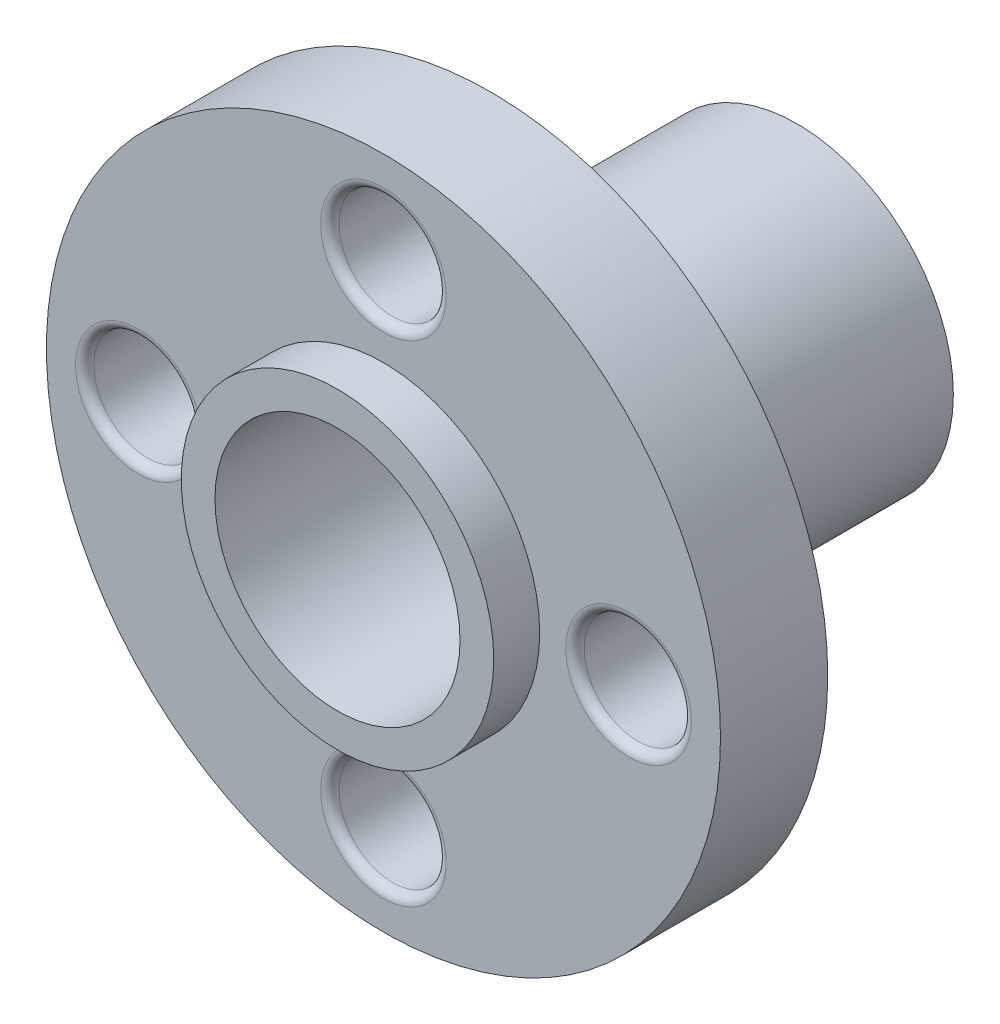
ISO-10303-21;
HEADER;
FILE_DESCRIPTION(('STEP AP214'),'2;1');
FILE_NAME('part.step','',(''),(''),'','','');
FILE_SCHEMA(('AUTOMOTIVE_DESIGN { 1 0 10303 214 1 1 1 1 }'));
ENDSEC;
DATA;
#1=APPLICATION_CONTEXT('core data for automotive mechanical design processes');
#2=APPLICATION_PROTOCOL_DEFINITION('international standard','automotive_design',2000,#1);
#3=PRODUCT_CONTEXT('',#1,'mechanical');
#4=PRODUCT('Part','Part','',(#3));
#5=PRODUCT_RELATED_PRODUCT_CATEGORY('part','',(#4));
#6=PRODUCT_DEFINITION_FORMATION('','',#4);
#7=PRODUCT_DEFINITION_CONTEXT('part definition',#1,'design');
#8=PRODUCT_DEFINITION('design','',#6,#7);
#9=PRODUCT_DEFINITION_SHAPE('','',#8);
#10=(LENGTH_UNIT() NAMED_UNIT(*) SI_UNIT(.MILLI.,.METRE.));
#11=(NAMED_UNIT(*) PLANE_ANGLE_UNIT() SI_UNIT($,.RADIAN.));
#12=(NAMED_UNIT(*) SI_UNIT($,.STERADIAN.) SOLID_ANGLE_UNIT());
#13=UNCERTAINTY_MEASURE_WITH_UNIT(LENGTH_MEASURE(1.E-05),#10,'distance_accuracy_value','');
#14=(GEOMETRIC_REPRESENTATION_CONTEXT(3) GLOBAL_UNCERTAINTY_ASSIGNED_CONTEXT((#13)) GLOBAL_UNIT_ASSIGNED_CONTEXT((#10,
#11,#12)) REPRESENTATION_CONTEXT('',''));
#15=CARTESIAN_POINT('',(0.,0.,0.));
#16=DIRECTION('',(0.,0.,1.));
#17=DIRECTION('',(1.,0.,0.));
#18=AXIS2_PLACEMENT_3D('',#15,#16,#17);
#19=CARTESIAN_POINT('',(0.,0.,-3.5));
#20=DIRECTION('',(0.,0.,1.));
#21=DIRECTION('',(1.,0.,0.));
#22=AXIS2_PLACEMENT_3D('',#19,#20,#21);
#23=CYLINDRICAL_SURFACE('',#22,11.);
#24=CARTESIAN_POINT('',(0.,0.,-3.5));
#25=DIRECTION('',(0.,0.,1.));
#26=DIRECTION('',(1.,0.,0.));
#27=AXIS2_PLACEMENT_3D('',#24,#25,#26);
#28=CIRCLE('',#27,11.);
#29=CARTESIAN_POINT('',(11.,0.,-3.5));
#30=VERTEX_POINT('',#29);
#31=EDGE_CURVE('E65',#30,#30,#28,.T.);
#32=ORIENTED_EDGE('',*,*,#31,.T.);
#33=EDGE_LOOP('',(#32));
#34=FACE_BOUND('',#33,.T.);
#35=CARTESIAN_POINT('',(0.,0.,0.));
#36=DIRECTION('',(0.,0.,1.));
#37=DIRECTION('',(1.,0.,0.));
#38=AXIS2_PLACEMENT_3D('',#35,#36,#37);
#39=CIRCLE('',#38,11.);
#40=CARTESIAN_POINT('',(11.,0.,0.));
#41=VERTEX_POINT('',#40);
#42=EDGE_CURVE('E66',#41,#41,#39,.T.);
#43=ORIENTED_EDGE('',*,*,#42,.F.);
#44=EDGE_LOOP('',(#43));
#45=FACE_BOUND('',#44,.T.);
#46=ADVANCED_FACE('F33',(#34,#45),#23,.T.);
#47=CARTESIAN_POINT('',(0.,0.,-3.5));
#48=DIRECTION('',(0.,0.,1.));
#49=DIRECTION('',(1.,0.,0.));
#50=AXIS2_PLACEMENT_3D('',#47,#48,#49);
#51=PLANE('',#50);
#52=CARTESIAN_POINT('',(-7.99999999999977,-2.27373675443232E-13,-3.5));
#53=DIRECTION('',(0.,0.,1.));
#54=DIRECTION('',(1.,0.,0.));
#55=AXIS2_PLACEMENT_3D('',#52,#53,#54);
#56=CIRCLE('',#55,1.75000000000036);
#57=CARTESIAN_POINT('',(-6.24999999999941,-2.27373675443232E-13,-3.5));
#58=VERTEX_POINT('',#57);
#59=EDGE_CURVE('E83',#58,#58,#56,.T.);
#60=ORIENTED_EDGE('',*,*,#59,.T.);
#61=EDGE_LOOP('',(#60));
#62=FACE_BOUND('',#61,.T.);
#63=CARTESIAN_POINT('',(4.52787916007828E-13,-8.,-3.5));
#64=DIRECTION('',(0.,0.,1.));
#65=DIRECTION('',(1.,0.,0.));
#66=AXIS2_PLACEMENT_3D('',#63,#64,#65);
#67=CIRCLE('',#66,1.75000000000049);
#68=CARTESIAN_POINT('',(1.75000000000094,-8.,-3.5));
#69=VERTEX_POINT('',#68);
#70=EDGE_CURVE('E80',#69,#69,#67,.T.);
#71=ORIENTED_EDGE('',*,*,#70,.T.);
#72=EDGE_LOOP('',(#71));
#73=FACE_BOUND('',#72,.T.);
#74=CARTESIAN_POINT('',(8.00000000000023,2.26393958003914E-13,-3.5));
#75=DIRECTION('',(0.,0.,1.));
#76=DIRECTION('',(1.,0.,0.));
#77=AXIS2_PLACEMENT_3D('',#74,#75,#76);
#78=CIRCLE('',#77,1.75000000000018);
#79=CARTESIAN_POINT('',(9.7500000000004,2.26393958003914E-13,-3.5));
#80=VERTEX_POINT('',#79);
#81=EDGE_CURVE('E77',#80,#80,#78,.T.);
#82=ORIENTED_EDGE('',*,*,#81,.T.);
#83=EDGE_LOOP('',(#82));
#84=FACE_BOUND('',#83,.T.);
#85=CARTESIAN_POINT('',(0.,8.,-3.5));
#86=DIRECTION('',(0.,0.,1.));
#87=DIRECTION('',(1.,0.,0.));
#88=AXIS2_PLACEMENT_3D('',#85,#86,#87);
#89=CIRCLE('',#88,1.75);
#90=CARTESIAN_POINT('',(1.75,8.,-3.5));
#91=VERTEX_POINT('',#90);
#92=EDGE_CURVE('E74',#91,#91,#89,.T.);
#93=ORIENTED_EDGE('',*,*,#92,.T.);
#94=EDGE_LOOP('',(#93));
#95=FACE_BOUND('',#94,.T.);
#96=CARTESIAN_POINT('',(0.,0.,-3.5));
#97=DIRECTION('',(0.,0.,1.));
#98=DIRECTION('',(1.,0.,0.));
#99=AXIS2_PLACEMENT_3D('',#96,#97,#98);
#100=CIRCLE('',#99,5.1);
#101=CARTESIAN_POINT('',(5.1,0.,-3.5));
#102=VERTEX_POINT('',#101);
#103=EDGE_CURVE('E86',#102,#102,#100,.T.);
#104=ORIENTED_EDGE('',*,*,#103,.T.);
#105=EDGE_LOOP('',(#104));
#106=FACE_BOUND('',#105,.T.);
#107=ORIENTED_EDGE('',*,*,#31,.F.);
#108=EDGE_LOOP('',(#107));
#109=FACE_BOUND('',#108,.T.);
#110=ADVANCED_FACE('F120',(#62,#73,#84,#95,#106,#109),#51,.F.);
#111=CARTESIAN_POINT('',(0.,0.,0.));
#112=DIRECTION('',(0.,0.,1.));
#113=DIRECTION('',(1.,0.,0.));
#114=AXIS2_PLACEMENT_3D('',#111,#112,#113);
#115=PLANE('',#114);
#116=CARTESIAN_POINT('',(8.00000000000023,2.26393958003914E-13,0.));
#117=DIRECTION('',(0.,0.,1.));
#118=DIRECTION('',(1.,0.,0.));
#119=AXIS2_PLACEMENT_3D('',#116,#117,#118);
#120=CIRCLE('',#119,2.05000000000018);
#121=CARTESIAN_POINT('',(10.0500000000004,2.26393958003914E-13,0.));
#122=VERTEX_POINT('',#121);
#123=EDGE_CURVE('E48',#122,#122,#120,.F.);
#124=ORIENTED_EDGE('',*,*,#123,.T.);
#125=EDGE_LOOP('',(#124));
#126=FACE_BOUND('',#125,.T.);
#127=CARTESIAN_POINT('',(4.52787916007828E-13,-8.,0.));
#128=DIRECTION('',(0.,0.,1.));
#129=DIRECTION('',(1.,0.,0.));
#130=AXIS2_PLACEMENT_3D('',#127,#128,#129);
#131=CIRCLE('',#130,2.05000000000049);
#132=CARTESIAN_POINT('',(2.05000000000094,-8.,0.));
#133=VERTEX_POINT('',#132);
#134=EDGE_CURVE('E53',#133,#133,#131,.F.);
#135=ORIENTED_EDGE('',*,*,#134,.T.);
#136=EDGE_LOOP('',(#135));
#137=FACE_BOUND('',#136,.T.);
#138=CARTESIAN_POINT('',(-7.99999999999977,-2.27373675443232E-13,0.));
#139=DIRECTION('',(0.,0.,1.));
#140=DIRECTION('',(1.,0.,0.));
#141=AXIS2_PLACEMENT_3D('',#138,#139,#140);
#142=CIRCLE('',#141,2.05000000000036);
#143=CARTESIAN_POINT('',(-5.94999999999941,-2.27373675443232E-13,0.));
#144=VERTEX_POINT('',#143);
#145=EDGE_CURVE('E56',#144,#144,#142,.F.);
#146=ORIENTED_EDGE('',*,*,#145,.T.);
#147=EDGE_LOOP('',(#146));
#148=FACE_BOUND('',#147,.T.);
#149=CARTESIAN_POINT('',(0.,8.,0.));
#150=DIRECTION('',(0.,0.,1.));
#151=DIRECTION('',(1.,0.,0.));
#152=AXIS2_PLACEMENT_3D('',#149,#150,#151);
#153=CIRCLE('',#152,2.05);
#154=CARTESIAN_POINT('',(2.05,8.,0.));
#155=VERTEX_POINT('',#154);
#156=EDGE_CURVE('E59',#155,#155,#153,.F.);
#157=ORIENTED_EDGE('',*,*,#156,.T.);
#158=EDGE_LOOP('',(#157));
#159=FACE_BOUND('',#158,.T.);
#160=CARTESIAN_POINT('',(0.,0.,0.));
#161=DIRECTION('',(0.,0.,1.));
#162=DIRECTION('',(1.,0.,0.));
#163=AXIS2_PLACEMENT_3D('',#160,#161,#162);
#164=CIRCLE('',#163,5.1);
#165=CARTESIAN_POINT('',(5.1,0.,0.));
#166=VERTEX_POINT('',#165);
#167=EDGE_CURVE('E69',#166,#166,#164,.T.);
#168=ORIENTED_EDGE('',*,*,#167,.F.);
#169=EDGE_LOOP('',(#168));
#170=FACE_BOUND('',#169,.T.);
#171=ORIENTED_EDGE('',*,*,#42,.T.);
#172=EDGE_LOOP('',(#171));
#173=FACE_BOUND('',#172,.T.);
#174=ADVANCED_FACE('F126',(#126,#137,#148,#159,#170,#173),#115,.T.);
#175=CARTESIAN_POINT('',(0.,8.,-3.5));
#176=DIRECTION('',(0.,0.,1.));
#177=DIRECTION('',(1.,0.,0.));
#178=AXIS2_PLACEMENT_3D('',#175,#176,#177);
#179=CYLINDRICAL_SURFACE('',#178,1.75);
#180=CARTESIAN_POINT('',(0.,8.,-0.3));
#181=DIRECTION('',(0.,0.,1.));
#182=DIRECTION('',(1.,0.,0.));
#183=AXIS2_PLACEMENT_3D('',#180,#181,#182);
#184=CIRCLE('',#183,1.75);
#185=CARTESIAN_POINT('',(1.75,8.,-0.3));
#186=VERTEX_POINT('',#185);
#187=EDGE_CURVE('E10',#186,#186,#184,.T.);
#188=ORIENTED_EDGE('',*,*,#187,.T.);
#189=EDGE_LOOP('',(#188));
#190=FACE_BOUND('',#189,.T.);
#191=ORIENTED_EDGE('',*,*,#92,.F.);
#192=EDGE_LOOP('',(#191));
#193=FACE_BOUND('',#192,.T.);
#194=ADVANCED_FACE('F146',(#190,#193),#179,.F.);
#195=CARTESIAN_POINT('',(8.00000000000023,2.26393958003914E-13,-3.5));
#196=DIRECTION('',(0.,0.,1.));
#197=DIRECTION('',(1.,0.,0.));
#198=AXIS2_PLACEMENT_3D('',#195,#196,#197);
#199=CYLINDRICAL_SURFACE('',#198,1.75000000000018);
#200=CARTESIAN_POINT('',(8.00000000000023,2.26393958003914E-13,-0.3));
#201=DIRECTION('',(0.,0.,1.));
#202=DIRECTION('',(1.,0.,0.));
#203=AXIS2_PLACEMENT_3D('',#200,#201,#202);
#204=CIRCLE('',#203,1.75000000000018);
#205=CARTESIAN_POINT('',(9.7500000000004,2.26393958003914E-13,-0.3));
#206=VERTEX_POINT('',#205);
#207=EDGE_CURVE('E62',#206,#206,#204,.T.);
#208=ORIENTED_EDGE('',*,*,#207,.T.);
#209=EDGE_LOOP('',(#208));
#210=FACE_BOUND('',#209,.T.);
#211=ORIENTED_EDGE('',*,*,#81,.F.);
#212=EDGE_LOOP('',(#211));
#213=FACE_BOUND('',#212,.T.);
#214=ADVANCED_FACE('F174',(#210,#213),#199,.F.);
#215=CARTESIAN_POINT('',(4.52787916007828E-13,-8.,-3.5));
#216=DIRECTION('',(0.,0.,1.));
#217=DIRECTION('',(1.,0.,0.));
#218=AXIS2_PLACEMENT_3D('',#215,#216,#217);
#219=CYLINDRICAL_SURFACE('',#218,1.75000000000049);
#220=CARTESIAN_POINT('',(4.52787916007828E-13,-8.,-0.3));
#221=DIRECTION('',(0.,0.,1.));
#222=DIRECTION('',(1.,0.,0.));
#223=AXIS2_PLACEMENT_3D('',#220,#221,#222);
#224=CIRCLE('',#223,1.75000000000049);
#225=CARTESIAN_POINT('',(1.75000000000094,-8.,-0.3));
#226=VERTEX_POINT('',#225);
#227=EDGE_CURVE('E44',#226,#226,#224,.T.);
#228=ORIENTED_EDGE('',*,*,#227,.T.);
#229=EDGE_LOOP('',(#228));
#230=FACE_BOUND('',#229,.T.);
#231=ORIENTED_EDGE('',*,*,#70,.F.);
#232=EDGE_LOOP('',(#231));
#233=FACE_BOUND('',#232,.T.);
#234=ADVANCED_FACE('F171',(#230,#233),#219,.F.);
#235=CARTESIAN_POINT('',(-7.99999999999977,-2.27373675443232E-13,-3.5));
#236=DIRECTION('',(0.,0.,1.));
#237=DIRECTION('',(1.,0.,0.));
#238=AXIS2_PLACEMENT_3D('',#235,#236,#237);
#239=CYLINDRICAL_SURFACE('',#238,1.75000000000036);
#240=CARTESIAN_POINT('',(-7.99999999999977,-2.27373675443232E-13,-0.3));
#241=DIRECTION('',(0.,0.,1.));
#242=DIRECTION('',(1.,0.,0.));
#243=AXIS2_PLACEMENT_3D('',#240,#241,#242);
#244=CIRCLE('',#243,1.75000000000036);
#245=CARTESIAN_POINT('',(-6.24999999999941,-2.27373675443232E-13,-0.3));
#246=VERTEX_POINT('',#245);
#247=EDGE_CURVE('E40',#246,#246,#244,.T.);
#248=ORIENTED_EDGE('',*,*,#247,.T.);
#249=EDGE_LOOP('',(#248));
#250=FACE_BOUND('',#249,.T.);
#251=ORIENTED_EDGE('',*,*,#59,.F.);
#252=EDGE_LOOP('',(#251));
#253=FACE_BOUND('',#252,.T.);
#254=ADVANCED_FACE('F166',(#250,#253),#239,.F.);
#255=CARTESIAN_POINT('',(0.,0.,-13.5));
#256=DIRECTION('',(0.,0.,1.));
#257=DIRECTION('',(1.,0.,0.));
#258=AXIS2_PLACEMENT_3D('',#255,#256,#257);
#259=CYLINDRICAL_SURFACE('',#258,5.1);
#260=CARTESIAN_POINT('',(0.,0.,-13.5));
#261=DIRECTION('',(0.,0.,1.));
#262=DIRECTION('',(1.,0.,0.));
#263=AXIS2_PLACEMENT_3D('',#260,#261,#262);
#264=CIRCLE('',#263,5.1);
#265=CARTESIAN_POINT('',(5.1,0.,-13.5));
#266=VERTEX_POINT('',#265);
#267=EDGE_CURVE('E89',#266,#266,#264,.T.);
#268=ORIENTED_EDGE('',*,*,#267,.T.);
#269=EDGE_LOOP('',(#268));
#270=FACE_BOUND('',#269,.T.);
#271=ORIENTED_EDGE('',*,*,#103,.F.);
#272=EDGE_LOOP('',(#271));
#273=FACE_BOUND('',#272,.T.);
#274=ADVANCED_FACE('F157',(#270,#273),#259,.T.);
#275=ORIENTED_EDGE('',*,*,#167,.T.);
#276=EDGE_LOOP('',(#275));
#277=FACE_BOUND('',#276,.T.);
#278=CARTESIAN_POINT('',(0.,0.,1.5));
#279=DIRECTION('',(0.,0.,1.));
#280=DIRECTION('',(1.,0.,0.));
#281=AXIS2_PLACEMENT_3D('',#278,#279,#280);
#282=CIRCLE('',#281,5.1);
#283=CARTESIAN_POINT('',(5.1,0.,1.5));
#284=VERTEX_POINT('',#283);
#285=EDGE_CURVE('E95',#284,#284,#282,.T.);
#286=ORIENTED_EDGE('',*,*,#285,.F.);
#287=EDGE_LOOP('',(#286));
#288=FACE_BOUND('',#287,.T.);
#289=ADVANCED_FACE('F154',(#277,#288),#259,.T.);
#290=CARTESIAN_POINT('',(0.,0.,-13.5));
#291=DIRECTION('',(0.,0.,1.));
#292=DIRECTION('',(1.,0.,0.));
#293=AXIS2_PLACEMENT_3D('',#290,#291,#292);
#294=PLANE('',#293);
#295=CARTESIAN_POINT('',(0.,0.,-13.5));
#296=DIRECTION('',(0.,0.,1.));
#297=DIRECTION('',(1.,0.,0.));
#298=AXIS2_PLACEMENT_3D('',#295,#296,#297);
#299=CIRCLE('',#298,4.);
#300=CARTESIAN_POINT('',(4.,0.,-13.5));
#301=VERTEX_POINT('',#300);
#302=EDGE_CURVE('E92',#301,#301,#299,.T.);
#303=ORIENTED_EDGE('',*,*,#302,.T.);
#304=EDGE_LOOP('',(#303));
#305=FACE_BOUND('',#304,.T.);
#306=ORIENTED_EDGE('',*,*,#267,.F.);
#307=EDGE_LOOP('',(#306));
#308=FACE_BOUND('',#307,.T.);
#309=ADVANCED_FACE('F116',(#305,#308),#294,.F.);
#310=CARTESIAN_POINT('',(0.,0.,-13.5));
#311=DIRECTION('',(0.,0.,1.));
#312=DIRECTION('',(1.,0.,0.));
#313=AXIS2_PLACEMENT_3D('',#310,#311,#312);
#314=CYLINDRICAL_SURFACE('',#313,4.);
#315=ORIENTED_EDGE('',*,*,#302,.F.);
#316=EDGE_LOOP('',(#315));
#317=FACE_BOUND('',#316,.T.);
#318=CARTESIAN_POINT('',(0.,0.,1.5));
#319=DIRECTION('',(0.,0.,1.));
#320=DIRECTION('',(1.,0.,0.));
#321=AXIS2_PLACEMENT_3D('',#318,#319,#320);
#322=CIRCLE('',#321,4.);
#323=CARTESIAN_POINT('',(4.,0.,1.5));
#324=VERTEX_POINT('',#323);
#325=EDGE_CURVE('E98',#324,#324,#322,.T.);
#326=ORIENTED_EDGE('',*,*,#325,.T.);
#327=EDGE_LOOP('',(#326));
#328=FACE_BOUND('',#327,.T.);
#329=ADVANCED_FACE('F102',(#317,#328),#314,.F.);
#330=CARTESIAN_POINT('',(0.,0.,1.5));
#331=DIRECTION('',(0.,0.,1.));
#332=DIRECTION('',(1.,0.,0.));
#333=AXIS2_PLACEMENT_3D('',#330,#331,#332);
#334=PLANE('',#333);
#335=ORIENTED_EDGE('',*,*,#285,.T.);
#336=EDGE_LOOP('',(#335));
#337=FACE_BOUND('',#336,.T.);
#338=ORIENTED_EDGE('',*,*,#325,.F.);
#339=EDGE_LOOP('',(#338));
#340=FACE_BOUND('',#339,.T.);
#341=ADVANCED_FACE('F104',(#337,#340),#334,.T.);
#342=CARTESIAN_POINT('',(8.00000000000023,2.26393958003914E-13,-0.3));
#343=DIRECTION('',(0.,0.,1.));
#344=DIRECTION('',(1.,0.,0.));
#345=AXIS2_PLACEMENT_3D('',#342,#343,#344);
#346=TOROIDAL_SURFACE('',#345,2.05000000000018,0.3);
#347=ORIENTED_EDGE('',*,*,#123,.F.);
#348=EDGE_LOOP('',(#347));
#349=FACE_BOUND('',#348,.T.);
#350=ORIENTED_EDGE('',*,*,#207,.F.);
#351=EDGE_LOOP('',(#350));
#352=FACE_BOUND('',#351,.T.);
#353=ADVANCED_FACE('F106',(#349,#352),#346,.T.);
#354=CARTESIAN_POINT('',(4.52787916007828E-13,-8.,-0.3));
#355=DIRECTION('',(0.,0.,1.));
#356=DIRECTION('',(1.,0.,0.));
#357=AXIS2_PLACEMENT_3D('',#354,#355,#356);
#358=TOROIDAL_SURFACE('',#357,2.05000000000049,0.3);
#359=ORIENTED_EDGE('',*,*,#134,.F.);
#360=EDGE_LOOP('',(#359));
#361=FACE_BOUND('',#360,.T.);
#362=ORIENTED_EDGE('',*,*,#227,.F.);
#363=EDGE_LOOP('',(#362));
#364=FACE_BOUND('',#363,.T.);
#365=ADVANCED_FACE('F113',(#361,#364),#358,.T.);
#366=CARTESIAN_POINT('',(-7.99999999999977,-2.27373675443232E-13,-0.3));
#367=DIRECTION('',(0.,0.,1.));
#368=DIRECTION('',(1.,0.,0.));
#369=AXIS2_PLACEMENT_3D('',#366,#367,#368);
#370=TOROIDAL_SURFACE('',#369,2.05000000000036,0.3);
#371=ORIENTED_EDGE('',*,*,#145,.F.);
#372=EDGE_LOOP('',(#371));
#373=FACE_BOUND('',#372,.T.);
#374=ORIENTED_EDGE('',*,*,#247,.F.);
#375=EDGE_LOOP('',(#374));
#376=FACE_BOUND('',#375,.T.);
#377=ADVANCED_FACE('F133',(#373,#376),#370,.T.);
#378=CARTESIAN_POINT('',(0.,8.,-0.3));
#379=DIRECTION('',(0.,0.,1.));
#380=DIRECTION('',(1.,0.,0.));
#381=AXIS2_PLACEMENT_3D('',#378,#379,#380);
#382=TOROIDAL_SURFACE('',#381,2.05,0.3);
#383=ORIENTED_EDGE('',*,*,#156,.F.);
#384=EDGE_LOOP('',(#383));
#385=FACE_BOUND('',#384,.T.);
#386=ORIENTED_EDGE('',*,*,#187,.F.);
#387=EDGE_LOOP('',(#386));
#388=FACE_BOUND('',#387,.T.);
#389=ADVANCED_FACE('F35',(#385,#388),#382,.T.);
#390=CLOSED_SHELL('',(#46,#110,#174,#194,#214,#234,#254,#274,#289,#309,#329,#341,#353,#365,#377,#389));
#391=MANIFOLD_SOLID_BREP('B2',#390);
#392=ADVANCED_BREP_SHAPE_REPRESENTATION('',(#18,#391),#14);
#393=SHAPE_DEFINITION_REPRESENTATION(#9,#392);
ENDSEC;
END-ISO-10303-21;
